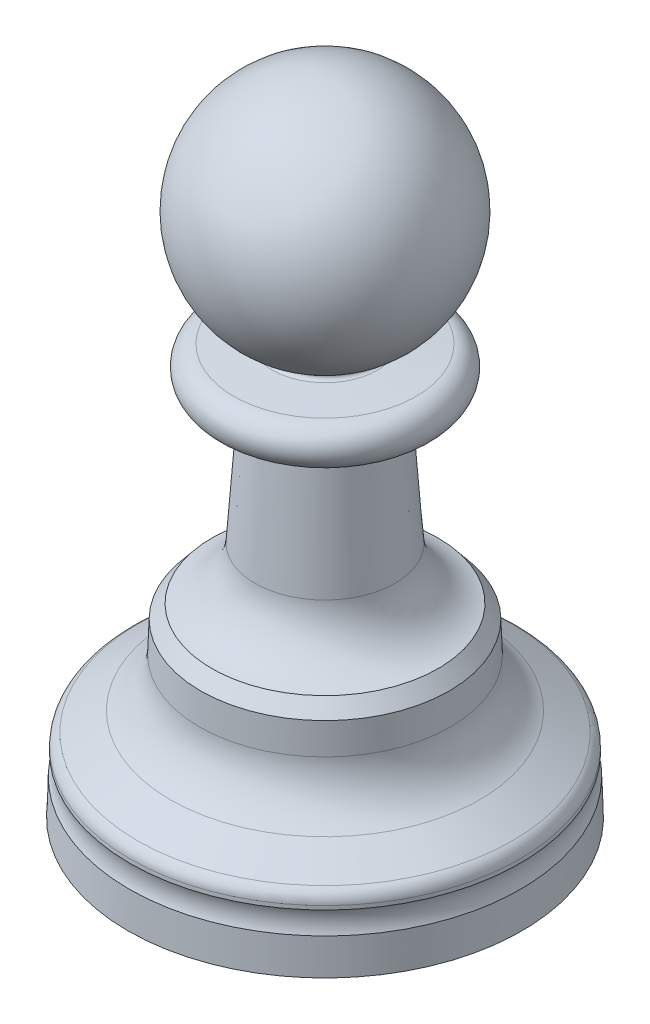
ISO-10303-21;
HEADER;
FILE_DESCRIPTION(('STEP AP214'),'2;1');
FILE_NAME('part.step','',(''),(''),'','','');
FILE_SCHEMA(('AUTOMOTIVE_DESIGN { 1 0 10303 214 1 1 1 1 }'));
ENDSEC;
DATA;
#1=APPLICATION_CONTEXT('core data for automotive mechanical design processes');
#2=APPLICATION_PROTOCOL_DEFINITION('international standard','automotive_design',2000,#1);
#3=PRODUCT_CONTEXT('',#1,'mechanical');
#4=PRODUCT('Part','Part','',(#3));
#5=PRODUCT_RELATED_PRODUCT_CATEGORY('part','',(#4));
#6=PRODUCT_DEFINITION_FORMATION('','',#4);
#7=PRODUCT_DEFINITION_CONTEXT('part definition',#1,'design');
#8=PRODUCT_DEFINITION('design','',#6,#7);
#9=PRODUCT_DEFINITION_SHAPE('','',#8);
#10=(LENGTH_UNIT() NAMED_UNIT(*) SI_UNIT(.MILLI.,.METRE.));
#11=(NAMED_UNIT(*) PLANE_ANGLE_UNIT() SI_UNIT($,.RADIAN.));
#12=(NAMED_UNIT(*) SI_UNIT($,.STERADIAN.) SOLID_ANGLE_UNIT());
#13=UNCERTAINTY_MEASURE_WITH_UNIT(LENGTH_MEASURE(1.E-05),#10,'distance_accuracy_value','');
#14=(GEOMETRIC_REPRESENTATION_CONTEXT(3) GLOBAL_UNCERTAINTY_ASSIGNED_CONTEXT((#13)) GLOBAL_UNIT_ASSIGNED_CONTEXT((#10,
#11,#12)) REPRESENTATION_CONTEXT('',''));
#15=CARTESIAN_POINT('',(0.,0.,0.));
#16=DIRECTION('',(0.,0.,1.));
#17=DIRECTION('',(1.,0.,0.));
#18=AXIS2_PLACEMENT_3D('',#15,#16,#17);
#19=CARTESIAN_POINT('',(25.789089,165.028624,0.));
#20=DIRECTION('',(0.,-1.,0.));
#21=DIRECTION('',(-1.,0.,0.));
#22=AXIS2_PLACEMENT_3D('',#19,#20,#21);
#23=SPHERICAL_SURFACE('',#22,1.14505464910517);
#24=CARTESIAN_POINT('',(25.789089,165.108499,0.));
#25=DIRECTION('',(0.,-1.,0.));
#26=DIRECTION('',(0.,0.,-1.));
#27=AXIS2_PLACEMENT_3D('',#24,#25,#26);
#28=CIRCLE('',#27,1.142265);
#29=CARTESIAN_POINT('',(25.789089,165.108499,-1.142265));
#30=VERTEX_POINT('',#29);
#31=EDGE_CURVE('E87',#30,#30,#28,.T.);
#32=ORIENTED_EDGE('',*,*,#31,.T.);
#33=EDGE_LOOP('',(#32));
#34=FACE_BOUND('',#33,.T.);
#35=ADVANCED_FACE('F29',(#34),#23,.F.);
#36=CARTESIAN_POINT('',(25.789089,161.173679,0.));
#37=DIRECTION('',(0.,-1.,0.));
#38=DIRECTION('',(-1.,0.,0.));
#39=AXIS2_PLACEMENT_3D('',#36,#37,#38);
#40=SPHERICAL_SURFACE('',#39,8.00000000000001);
#41=CARTESIAN_POINT('',(25.789089,153.988065721632,0.));
#42=DIRECTION('',(0.,-1.,0.));
#43=DIRECTION('',(0.,0.,-1.));
#44=AXIS2_PLACEMENT_3D('',#41,#42,#43);
#45=CIRCLE('',#44,3.5166691362344);
#46=CARTESIAN_POINT('',(25.789089,153.988065721632,-3.5166691362344));
#47=VERTEX_POINT('',#46);
#48=EDGE_CURVE('E10',#47,#47,#45,.T.);
#49=ORIENTED_EDGE('',*,*,#48,.F.);
#50=EDGE_LOOP('',(#49));
#51=FACE_BOUND('',#50,.T.);
#52=ADVANCED_FACE('F189',(#51),#40,.T.);
#53=CARTESIAN_POINT('',(25.789089,153.763515,0.));
#54=DIRECTION('',(0.,-1.,0.));
#55=DIRECTION('',(0.,0.,-1.));
#56=AXIS2_PLACEMENT_3D('',#53,#54,#55);
#57=TOROIDAL_SURFACE('',#56,3.626565,0.249999794282792);
#58=CARTESIAN_POINT('',(25.789089,153.514466541119,0.));
#59=DIRECTION('',(0.,-1.,0.));
#60=DIRECTION('',(0.,0.,-1.));
#61=AXIS2_PLACEMENT_3D('',#58,#59,#60);
#62=CIRCLE('',#61,3.60477595985291);
#63=CARTESIAN_POINT('',(25.789089,153.514466541119,-3.60477595985291));
#64=VERTEX_POINT('',#63);
#65=EDGE_CURVE('E35',#64,#64,#62,.T.);
#66=ORIENTED_EDGE('',*,*,#65,.F.);
#67=EDGE_LOOP('',(#66));
#68=FACE_BOUND('',#67,.T.);
#69=ORIENTED_EDGE('',*,*,#48,.T.);
#70=EDGE_LOOP('',(#69));
#71=FACE_BOUND('',#70,.T.);
#72=ADVANCED_FACE('F184',(#68,#71),#57,.F.);
#73=CARTESIAN_POINT('',(25.789089,153.514466541119,0.));
#74=DIRECTION('',(0.,-1.,0.));
#75=DIRECTION('',(0.,0.,-1.));
#76=AXIS2_PLACEMENT_3D('',#73,#74,#75);
#77=CONICAL_SURFACE('',#76,3.60477595985291,1.48353011546762);
#78=CARTESIAN_POINT('',(25.789089,153.282624,0.));
#79=DIRECTION('',(0.,-1.,0.));
#80=DIRECTION('',(0.,0.,-1.));
#81=AXIS2_PLACEMENT_3D('',#78,#79,#80);
#82=CIRCLE('',#81,6.254756);
#83=CARTESIAN_POINT('',(25.789089,153.282624,-6.254756));
#84=VERTEX_POINT('',#83);
#85=EDGE_CURVE('E39',#84,#84,#82,.T.);
#86=ORIENTED_EDGE('',*,*,#85,.F.);
#87=EDGE_LOOP('',(#86));
#88=FACE_BOUND('',#87,.T.);
#89=ORIENTED_EDGE('',*,*,#65,.T.);
#90=EDGE_LOOP('',(#89));
#91=FACE_BOUND('',#90,.T.);
#92=ADVANCED_FACE('F179',(#88,#91),#77,.T.);
#93=CARTESIAN_POINT('',(25.789089,151.923679,0.));
#94=DIRECTION('',(0.,-1.,0.));
#95=DIRECTION('',(0.,0.,-1.));
#96=AXIS2_PLACEMENT_3D('',#93,#94,#95);
#97=TOROIDAL_SURFACE('',#96,6.135864,1.36413592456508);
#98=CARTESIAN_POINT('',(25.789089,150.564734,0.));
#99=DIRECTION('',(0.,-1.,0.));
#100=DIRECTION('',(0.,0.,-1.));
#101=AXIS2_PLACEMENT_3D('',#98,#99,#100);
#102=CIRCLE('',#101,6.254756);
#103=CARTESIAN_POINT('',(25.789089,150.564734,-6.254756));
#104=VERTEX_POINT('',#103);
#105=EDGE_CURVE('E43',#104,#104,#102,.T.);
#106=ORIENTED_EDGE('',*,*,#105,.F.);
#107=EDGE_LOOP('',(#106));
#108=FACE_BOUND('',#107,.T.);
#109=ORIENTED_EDGE('',*,*,#85,.T.);
#110=EDGE_LOOP('',(#109));
#111=FACE_BOUND('',#110,.T.);
#112=ADVANCED_FACE('F173',(#108,#111),#97,.T.);
#113=CARTESIAN_POINT('',(25.789089,150.564734,0.));
#114=DIRECTION('',(0.,1.,0.));
#115=DIRECTION('',(0.,0.,1.));
#116=AXIS2_PLACEMENT_3D('',#113,#114,#115);
#117=CONICAL_SURFACE('',#116,6.254756,1.48353016436972);
#118=CARTESIAN_POINT('',(25.789089,150.425766,0.));
#119=DIRECTION('',(0.,-1.,0.));
#120=DIRECTION('',(0.,0.,-1.));
#121=AXIS2_PLACEMENT_3D('',#118,#119,#120);
#122=CIRCLE('',#121,4.666339);
#123=CARTESIAN_POINT('',(25.789089,150.425766,-4.666339));
#124=VERTEX_POINT('',#123);
#125=EDGE_CURVE('E48',#124,#124,#122,.T.);
#126=ORIENTED_EDGE('',*,*,#125,.F.);
#127=EDGE_LOOP('',(#126));
#128=FACE_BOUND('',#127,.T.);
#129=ORIENTED_EDGE('',*,*,#105,.T.);
#130=EDGE_LOOP('',(#129));
#131=FACE_BOUND('',#130,.T.);
#132=ADVANCED_FACE('F167',(#128,#131),#117,.T.);
#133=CARTESIAN_POINT('',(25.789089,149.927668,0.));
#134=DIRECTION('',(0.,-1.,0.));
#135=DIRECTION('',(0.,0.,-1.));
#136=AXIS2_PLACEMENT_3D('',#133,#134,#135);
#137=TOROIDAL_SURFACE('',#136,4.709917,0.500000309047783);
#138=CARTESIAN_POINT('',(25.789089,149.892789975541,0.));
#139=DIRECTION('',(0.,-1.,0.));
#140=DIRECTION('',(0.,0.,-1.));
#141=AXIS2_PLACEMENT_3D('',#138,#139,#140);
#142=CIRCLE('',#141,4.21113465021435);
#143=CARTESIAN_POINT('',(25.789089,149.892789975541,-4.21113465021435));
#144=VERTEX_POINT('',#143);
#145=EDGE_CURVE('E51',#144,#144,#142,.T.);
#146=ORIENTED_EDGE('',*,*,#145,.F.);
#147=EDGE_LOOP('',(#146));
#148=FACE_BOUND('',#147,.T.);
#149=ORIENTED_EDGE('',*,*,#125,.T.);
#150=EDGE_LOOP('',(#149));
#151=FACE_BOUND('',#150,.T.);
#152=ADVANCED_FACE('F161',(#148,#151),#137,.F.);
#153=CARTESIAN_POINT('',(25.789089,149.892789975541,0.));
#154=DIRECTION('',(0.,-1.,0.));
#155=DIRECTION('',(0.,0.,-1.));
#156=AXIS2_PLACEMENT_3D('',#153,#154,#155);
#157=CONICAL_SURFACE('',#156,4.21113465021435,0.0698131709830079);
#158=CARTESIAN_POINT('',(25.789089,141.457723,0.));
#159=DIRECTION('',(0.,-1.,0.));
#160=DIRECTION('',(0.,0.,-1.));
#161=AXIS2_PLACEMENT_3D('',#158,#159,#160);
#162=CIRCLE('',#161,4.800972);
#163=CARTESIAN_POINT('',(25.789089,141.457723,-4.800972));
#164=VERTEX_POINT('',#163);
#165=EDGE_CURVE('E54',#164,#164,#162,.T.);
#166=ORIENTED_EDGE('',*,*,#165,.F.);
#167=EDGE_LOOP('',(#166));
#168=FACE_BOUND('',#167,.T.);
#169=ORIENTED_EDGE('',*,*,#145,.T.);
#170=EDGE_LOOP('',(#169));
#171=FACE_BOUND('',#170,.T.);
#172=ADVANCED_FACE('F155',(#168,#171),#157,.T.);
#173=CARTESIAN_POINT('',(25.789089,141.736749,0.));
#174=DIRECTION('',(0.,-1.,0.));
#175=DIRECTION('',(0.,0.,-1.));
#176=AXIS2_PLACEMENT_3D('',#173,#174,#175);
#177=TOROIDAL_SURFACE('',#176,8.791228,3.9999997326623);
#178=CARTESIAN_POINT('',(25.789089,137.873045928411,0.));
#179=DIRECTION('',(0.,-1.,0.));
#180=DIRECTION('',(0.,0.,-1.));
#181=AXIS2_PLACEMENT_3D('',#178,#179,#180);
#182=CIRCLE('',#181,7.75595198081784);
#183=CARTESIAN_POINT('',(25.789089,137.873045928411,-7.75595198081784));
#184=VERTEX_POINT('',#183);
#185=EDGE_CURVE('E57',#184,#184,#182,.T.);
#186=ORIENTED_EDGE('',*,*,#185,.F.);
#187=EDGE_LOOP('',(#186));
#188=FACE_BOUND('',#187,.T.);
#189=ORIENTED_EDGE('',*,*,#165,.T.);
#190=EDGE_LOOP('',(#189));
#191=FACE_BOUND('',#190,.T.);
#192=ADVANCED_FACE('F149',(#188,#191),#177,.F.);
#193=CARTESIAN_POINT('',(25.789089,137.873045928411,0.));
#194=DIRECTION('',(0.,-1.,0.));
#195=DIRECTION('',(0.,0.,-1.));
#196=AXIS2_PLACEMENT_3D('',#193,#194,#195);
#197=CONICAL_SURFACE('',#196,7.75595198081784,0.686813129617856);
#198=CARTESIAN_POINT('',(25.789089,136.934168998802,0.));
#199=DIRECTION('',(0.,-1.,0.));
#200=DIRECTION('',(0.,0.,-1.));
#201=AXIS2_PLACEMENT_3D('',#198,#199,#200);
#202=CIRCLE('',#201,8.52582396569891);
#203=CARTESIAN_POINT('',(25.789089,136.934168998802,-8.52582396569891));
#204=VERTEX_POINT('',#203);
#205=EDGE_CURVE('E60',#204,#204,#202,.T.);
#206=ORIENTED_EDGE('',*,*,#205,.F.);
#207=EDGE_LOOP('',(#206));
#208=FACE_BOUND('',#207,.T.);
#209=ORIENTED_EDGE('',*,*,#185,.T.);
#210=EDGE_LOOP('',(#209));
#211=FACE_BOUND('',#210,.T.);
#212=ADVANCED_FACE('F143',(#208,#211),#197,.T.);
#213=CARTESIAN_POINT('',(25.789089,136.934168998802,0.));
#214=DIRECTION('',(0.,-1.,0.));
#215=DIRECTION('',(0.,0.,-1.));
#216=AXIS2_PLACEMENT_3D('',#213,#214,#215);
#217=CONICAL_SURFACE('',#216,8.52582396569891,0.0349064910156993);
#218=CARTESIAN_POINT('',(25.789089,134.82851,0.));
#219=DIRECTION('',(0.,-1.,0.));
#220=DIRECTION('',(0.,0.,-1.));
#221=AXIS2_PLACEMENT_3D('',#218,#219,#220);
#222=CIRCLE('',#221,8.599355);
#223=CARTESIAN_POINT('',(25.789089,134.82851,-8.599355));
#224=VERTEX_POINT('',#223);
#225=EDGE_CURVE('E63',#224,#224,#222,.T.);
#226=ORIENTED_EDGE('',*,*,#225,.F.);
#227=EDGE_LOOP('',(#226));
#228=FACE_BOUND('',#227,.T.);
#229=ORIENTED_EDGE('',*,*,#205,.T.);
#230=EDGE_LOOP('',(#229));
#231=FACE_BOUND('',#230,.T.);
#232=ADVANCED_FACE('F137',(#228,#231),#217,.T.);
#233=CARTESIAN_POINT('',(25.789089,134.968108,0.));
#234=DIRECTION('',(0.,-1.,0.));
#235=DIRECTION('',(0.,0.,-1.));
#236=AXIS2_PLACEMENT_3D('',#233,#234,#235);
#237=TOROIDAL_SURFACE('',#236,12.596918,4.00000001293605);
#238=CARTESIAN_POINT('',(25.789089,131.504006277444,0.));
#239=DIRECTION('',(0.,-1.,0.));
#240=DIRECTION('',(0.,0.,-1.));
#241=AXIS2_PLACEMENT_3D('',#238,#239,#240);
#242=CIRCLE('',#241,10.5969181601822);
#243=CARTESIAN_POINT('',(25.789089,131.504006277444,-10.5969181601822));
#244=VERTEX_POINT('',#243);
#245=EDGE_CURVE('E66',#244,#244,#242,.T.);
#246=ORIENTED_EDGE('',*,*,#245,.F.);
#247=EDGE_LOOP('',(#246));
#248=FACE_BOUND('',#247,.T.);
#249=ORIENTED_EDGE('',*,*,#225,.T.);
#250=EDGE_LOOP('',(#249));
#251=FACE_BOUND('',#250,.T.);
#252=ADVANCED_FACE('F131',(#248,#251),#237,.F.);
#253=CARTESIAN_POINT('',(25.789089,131.504006277444,0.));
#254=DIRECTION('',(0.,-1.,0.));
#255=DIRECTION('',(0.,0.,-1.));
#256=AXIS2_PLACEMENT_3D('',#253,#254,#255);
#257=CONICAL_SURFACE('',#256,10.5969181601822,1.04719745762099);
#258=CARTESIAN_POINT('',(25.789089,130.200833,0.));
#259=DIRECTION('',(0.,-1.,0.));
#260=DIRECTION('',(0.,0.,-1.));
#261=AXIS2_PLACEMENT_3D('',#258,#259,#260);
#262=CIRCLE('',#261,12.85408);
#263=CARTESIAN_POINT('',(25.789089,130.200833,-12.85408));
#264=VERTEX_POINT('',#263);
#265=EDGE_CURVE('E69',#264,#264,#262,.T.);
#266=ORIENTED_EDGE('',*,*,#265,.F.);
#267=EDGE_LOOP('',(#266));
#268=FACE_BOUND('',#267,.T.);
#269=ORIENTED_EDGE('',*,*,#245,.T.);
#270=EDGE_LOOP('',(#269));
#271=FACE_BOUND('',#270,.T.);
#272=ADVANCED_FACE('F125',(#268,#271),#257,.T.);
#273=CARTESIAN_POINT('',(25.789089,129.334808,0.));
#274=DIRECTION('',(0.,-1.,0.));
#275=DIRECTION('',(0.,0.,-1.));
#276=AXIS2_PLACEMENT_3D('',#273,#274,#275);
#277=TOROIDAL_SURFACE('',#276,12.35408,0.999999650312414);
#278=CARTESIAN_POINT('',(25.789089,129.369706982368,0.));
#279=DIRECTION('',(0.,-1.,0.));
#280=DIRECTION('',(0.,0.,-1.));
#281=AXIS2_PLACEMENT_3D('',#278,#279,#280);
#282=CIRCLE('',#281,13.3534704950792);
#283=CARTESIAN_POINT('',(25.789089,129.369706982368,-13.3534704950792));
#284=VERTEX_POINT('',#283);
#285=EDGE_CURVE('E72',#284,#284,#282,.T.);
#286=ORIENTED_EDGE('',*,*,#285,.F.);
#287=EDGE_LOOP('',(#286));
#288=FACE_BOUND('',#287,.T.);
#289=ORIENTED_EDGE('',*,*,#265,.T.);
#290=EDGE_LOOP('',(#289));
#291=FACE_BOUND('',#290,.T.);
#292=ADVANCED_FACE('F119',(#288,#291),#277,.T.);
#293=CARTESIAN_POINT('',(25.789089,129.369706982368,0.));
#294=DIRECTION('',(0.,-1.,0.));
#295=DIRECTION('',(0.,0.,-1.));
#296=AXIS2_PLACEMENT_3D('',#293,#294,#295);
#297=CONICAL_SURFACE('',#296,13.3534704950792,0.0349070917826499);
#298=CARTESIAN_POINT('',(25.789089,129.11134,0.));
#299=DIRECTION('',(0.,-1.,0.));
#300=DIRECTION('',(0.,0.,-1.));
#301=AXIS2_PLACEMENT_3D('',#298,#299,#300);
#302=CIRCLE('',#301,13.362493);
#303=CARTESIAN_POINT('',(25.789089,129.11134,-13.362493));
#304=VERTEX_POINT('',#303);
#305=EDGE_CURVE('E75',#304,#304,#302,.T.);
#306=ORIENTED_EDGE('',*,*,#305,.F.);
#307=EDGE_LOOP('',(#306));
#308=FACE_BOUND('',#307,.T.);
#309=ORIENTED_EDGE('',*,*,#285,.T.);
#310=EDGE_LOOP('',(#309));
#311=FACE_BOUND('',#310,.T.);
#312=ADVANCED_FACE('F113',(#308,#311),#297,.T.);
#313=CARTESIAN_POINT('',(25.789089,128.423679,0.));
#314=DIRECTION('',(0.,-1.,0.));
#315=DIRECTION('',(0.,0.,-1.));
#316=AXIS2_PLACEMENT_3D('',#313,#314,#315);
#317=TOROIDAL_SURFACE('',#316,15.240557,2.00000056318155);
#318=CARTESIAN_POINT('',(25.789089,127.606685021825,0.));
#319=DIRECTION('',(0.,-1.,0.));
#320=DIRECTION('',(0.,0.,-1.));
#321=AXIS2_PLACEMENT_3D('',#318,#319,#320);
#322=CIRCLE('',#321,13.4150370487663);
#323=CARTESIAN_POINT('',(25.789089,127.606685021825,-13.4150370487663));
#324=VERTEX_POINT('',#323);
#325=EDGE_CURVE('E78',#324,#324,#322,.T.);
#326=ORIENTED_EDGE('',*,*,#325,.F.);
#327=EDGE_LOOP('',(#326));
#328=FACE_BOUND('',#327,.T.);
#329=ORIENTED_EDGE('',*,*,#305,.T.);
#330=EDGE_LOOP('',(#329));
#331=FACE_BOUND('',#330,.T.);
#332=ADVANCED_FACE('F107',(#328,#331),#317,.F.);
#333=CARTESIAN_POINT('',(25.789089,127.606685021825,0.));
#334=DIRECTION('',(0.,-1.,0.));
#335=DIRECTION('',(0.,0.,-1.));
#336=AXIS2_PLACEMENT_3D('',#333,#334,#335);
#337=CONICAL_SURFACE('',#336,13.4150370487663,0.0349067938983116);
#338=CARTESIAN_POINT('',(25.789089,125.173679,0.));
#339=DIRECTION('',(0.,-1.,0.));
#340=DIRECTION('',(0.,0.,-1.));
#341=AXIS2_PLACEMENT_3D('',#338,#339,#340);
#342=CIRCLE('',#341,13.5);
#343=CARTESIAN_POINT('',(25.789089,125.173679,-13.5));
#344=VERTEX_POINT('',#343);
#345=EDGE_CURVE('E81',#344,#344,#342,.T.);
#346=ORIENTED_EDGE('',*,*,#345,.F.);
#347=EDGE_LOOP('',(#346));
#348=FACE_BOUND('',#347,.T.);
#349=ORIENTED_EDGE('',*,*,#325,.T.);
#350=EDGE_LOOP('',(#349));
#351=FACE_BOUND('',#350,.T.);
#352=ADVANCED_FACE('F101',(#348,#351),#337,.T.);
#353=CARTESIAN_POINT('',(21.854309,125.173679,0.));
#354=DIRECTION('',(0.,1.,0.));
#355=DIRECTION('',(0.,0.,1.));
#356=AXIS2_PLACEMENT_3D('',#353,#354,#355);
#357=PLANE('',#356);
#358=CARTESIAN_POINT('',(25.789089,125.173679,0.));
#359=DIRECTION('',(0.,-1.,0.));
#360=DIRECTION('',(0.,0.,-1.));
#361=AXIS2_PLACEMENT_3D('',#358,#359,#360);
#362=CIRCLE('',#361,3.93478);
#363=CARTESIAN_POINT('',(25.789089,125.173679,-3.93478));
#364=VERTEX_POINT('',#363);
#365=EDGE_CURVE('E84',#364,#364,#362,.T.);
#366=ORIENTED_EDGE('',*,*,#365,.F.);
#367=EDGE_LOOP('',(#366));
#368=FACE_BOUND('',#367,.T.);
#369=ORIENTED_EDGE('',*,*,#345,.T.);
#370=EDGE_LOOP('',(#369));
#371=FACE_BOUND('',#370,.T.);
#372=ADVANCED_FACE('F95',(#368,#371),#357,.F.);
#373=CARTESIAN_POINT('',(25.789089,125.173679,0.));
#374=DIRECTION('',(0.,-1.,0.));
#375=DIRECTION('',(0.,0.,-1.));
#376=AXIS2_PLACEMENT_3D('',#373,#374,#375);
#377=CONICAL_SURFACE('',#376,3.93478,0.0698131788478084);
#378=CARTESIAN_POINT('',(25.789089,165.108499,-1.142265));
#379=CARTESIAN_POINT('',(25.789089,164.692511291667,-1.17135369791667));
#380=CARTESIAN_POINT('',(25.789089,164.276523583333,-1.20044239583334));
#381=CARTESIAN_POINT('',(25.789089,163.444548166667,-1.25861979166667));
#382=CARTESIAN_POINT('',(25.789089,163.028560458333,-1.28770848958334));
#383=CARTESIAN_POINT('',(25.789089,162.196585041667,-1.34588588541667));
#384=CARTESIAN_POINT('',(25.789089,161.780597333333,-1.37497458333334));
#385=CARTESIAN_POINT('',(25.789089,160.948621916667,-1.43315197916667));
#386=CARTESIAN_POINT('',(25.789089,160.532634208333,-1.46224067708334));
#387=CARTESIAN_POINT('',(25.789089,159.700658791667,-1.52041807291667));
#388=CARTESIAN_POINT('',(25.789089,159.284671083333,-1.54950677083334));
#389=CARTESIAN_POINT('',(25.789089,158.452695666667,-1.60768416666667));
#390=CARTESIAN_POINT('',(25.789089,158.036707958333,-1.63677286458334));
#391=CARTESIAN_POINT('',(25.789089,157.204732541667,-1.69495026041667));
#392=CARTESIAN_POINT('',(25.789089,156.788744833333,-1.72403895833334));
#393=CARTESIAN_POINT('',(25.789089,155.956769416667,-1.78221635416667));
#394=CARTESIAN_POINT('',(25.789089,155.540781708333,-1.81130505208333));
#395=CARTESIAN_POINT('',(25.789089,154.708806291667,-1.86948244791667));
#396=CARTESIAN_POINT('',(25.789089,154.292818583333,-1.89857114583334));
#397=CARTESIAN_POINT('',(25.789089,153.460843166667,-1.95674854166667));
#398=CARTESIAN_POINT('',(25.789089,153.044855458333,-1.98583723958333));
#399=CARTESIAN_POINT('',(25.789089,152.212880041667,-2.04401463541667));
#400=CARTESIAN_POINT('',(25.789089,151.796892333333,-2.07310333333333));
#401=CARTESIAN_POINT('',(25.789089,150.964916916667,-2.13128072916667));
#402=CARTESIAN_POINT('',(25.789089,150.548929208333,-2.16036942708333));
#403=CARTESIAN_POINT('',(25.789089,149.716953791667,-2.21854682291667));
#404=CARTESIAN_POINT('',(25.789089,149.300966083333,-2.24763552083333));
#405=CARTESIAN_POINT('',(25.789089,148.468990666667,-2.30581291666667));
#406=CARTESIAN_POINT('',(25.789089,148.053002958333,-2.33490161458333));
#407=CARTESIAN_POINT('',(25.789089,147.221027541667,-2.39307901041667));
#408=CARTESIAN_POINT('',(25.789089,146.805039833333,-2.42216770833333));
#409=CARTESIAN_POINT('',(25.789089,145.973064416667,-2.48034510416667));
#410=CARTESIAN_POINT('',(25.789089,145.557076708333,-2.50943380208333));
#411=CARTESIAN_POINT('',(25.789089,144.725101291667,-2.56761119791667));
#412=CARTESIAN_POINT('',(25.789089,144.309113583333,-2.59669989583333));
#413=CARTESIAN_POINT('',(25.789089,143.477138166667,-2.65487729166667));
#414=CARTESIAN_POINT('',(25.789089,143.061150458333,-2.68396598958333));
#415=CARTESIAN_POINT('',(25.789089,142.229175041667,-2.74214338541667));
#416=CARTESIAN_POINT('',(25.789089,141.813187333333,-2.77123208333333));
#417=CARTESIAN_POINT('',(25.789089,140.981211916667,-2.82940947916667));
#418=CARTESIAN_POINT('',(25.789089,140.565224208333,-2.85849817708333));
#419=CARTESIAN_POINT('',(25.789089,139.733248791667,-2.91667557291667));
#420=CARTESIAN_POINT('',(25.789089,139.317261083333,-2.94576427083333));
#421=CARTESIAN_POINT('',(25.789089,138.485285666667,-3.00394166666667));
#422=CARTESIAN_POINT('',(25.789089,138.069297958333,-3.03303036458333));
#423=CARTESIAN_POINT('',(25.789089,137.237322541667,-3.09120776041667));
#424=CARTESIAN_POINT('',(25.789089,136.821334833333,-3.12029645833333));
#425=CARTESIAN_POINT('',(25.789089,135.989359416667,-3.17847385416667));
#426=CARTESIAN_POINT('',(25.789089,135.573371708333,-3.20756255208333));
#427=CARTESIAN_POINT('',(25.789089,134.741396291667,-3.26573994791667));
#428=CARTESIAN_POINT('',(25.789089,134.325408583333,-3.29482864583333));
#429=CARTESIAN_POINT('',(25.789089,133.493433166667,-3.35300604166667));
#430=CARTESIAN_POINT('',(25.789089,133.077445458333,-3.38209473958333));
#431=CARTESIAN_POINT('',(25.789089,132.245470041667,-3.44027213541667));
#432=CARTESIAN_POINT('',(25.789089,131.829482333333,-3.46936083333333));
#433=CARTESIAN_POINT('',(25.789089,130.997506916667,-3.52753822916667));
#434=CARTESIAN_POINT('',(25.789089,130.581519208333,-3.55662692708333));
#435=CARTESIAN_POINT('',(25.789089,129.749543791667,-3.61480432291666));
#436=CARTESIAN_POINT('',(25.789089,129.333556083333,-3.64389302083333));
#437=CARTESIAN_POINT('',(25.789089,128.501580666667,-3.70207041666666));
#438=CARTESIAN_POINT('',(25.789089,128.085592958333,-3.73115911458333));
#439=CARTESIAN_POINT('',(25.789089,127.253617541667,-3.78933651041666));
#440=CARTESIAN_POINT('',(25.789089,126.837629833333,-3.81842520833333));
#441=CARTESIAN_POINT('',(25.789089,126.005654416667,-3.87660260416666));
#442=CARTESIAN_POINT('',(25.789089,125.589666708333,-3.90569130208333));
#443=CARTESIAN_POINT('',(25.789089,125.173679,-3.93478));
#444=B_SPLINE_CURVE_WITH_KNOTS('',3,(#378,#379,#380,#381,#382,#383,#384,#385,#386,#387,#388,
#389,#390,#391,#392,#393,#394,#395,#396,#397,#398,#399,#400,#401,#402,#403,#404,#405,#406,#407,
#408,#409,#410,#411,#412,#413,#414,#415,#416,#417,#418,#419,#420,#421,#422,#423,#424,#425,#426,
#427,#428,#429,#430,#431,#432,#433,#434,#435,#436,#437,#438,#439,#440,#441,#442,#443),
.UNSPECIFIED.,.F.,.F.,(4,2,2,2,2,2,2,2,2,2,2,2,2,2,2,2,2,2,2,2,2,2,2,2,2,2,2,2,2,2,2,2,4),(0.,
1.25101052452736,2.50202104905467,3.753031573582,5.00404209810933,6.25505262263666,
7.506063147164,8.75707367169133,10.0080841962187,11.259094720746,12.5101052452733,
13.7611157698007,15.012126294328,16.2631368188553,17.5141473433827,18.76515786791,
20.0161683924373,21.2671789169646,22.518189441492,23.7691999660193,25.0202104905466,
26.271221015074,27.5222315396013,28.7732420641286,30.0242525886559,31.2752631131833,
32.5262736377106,33.7772841622379,35.0282946867653,36.2793052112926,37.5303157358199,
38.7813262603473,40.0323367848746),.UNSPECIFIED.);
#445=EDGE_CURVE('BSEAM92',#30,#364,#444,.T.);
#446=ORIENTED_EDGE('',*,*,#31,.F.);
#447=ORIENTED_EDGE('',*,*,#365,.T.);
#448=ORIENTED_EDGE('',*,*,#445,.T.);
#449=ORIENTED_EDGE('',*,*,#445,.F.);
#450=EDGE_LOOP('',(#446,#448,#447,#449));
#451=FACE_BOUND('',#450,.T.);
#452=ADVANCED_FACE('F92',(#451),#377,.F.);
#453=CLOSED_SHELL('',(#35,#52,#72,#92,#112,#132,#152,#172,#192,#212,#232,#252,#272,#292,#312,
#332,#352,#372,#452));
#454=MANIFOLD_SOLID_BREP('B2',#453);
#455=ADVANCED_BREP_SHAPE_REPRESENTATION('',(#18,#454),#14);
#456=SHAPE_DEFINITION_REPRESENTATION(#9,#455);
ENDSEC;
END-ISO-10303-21;
